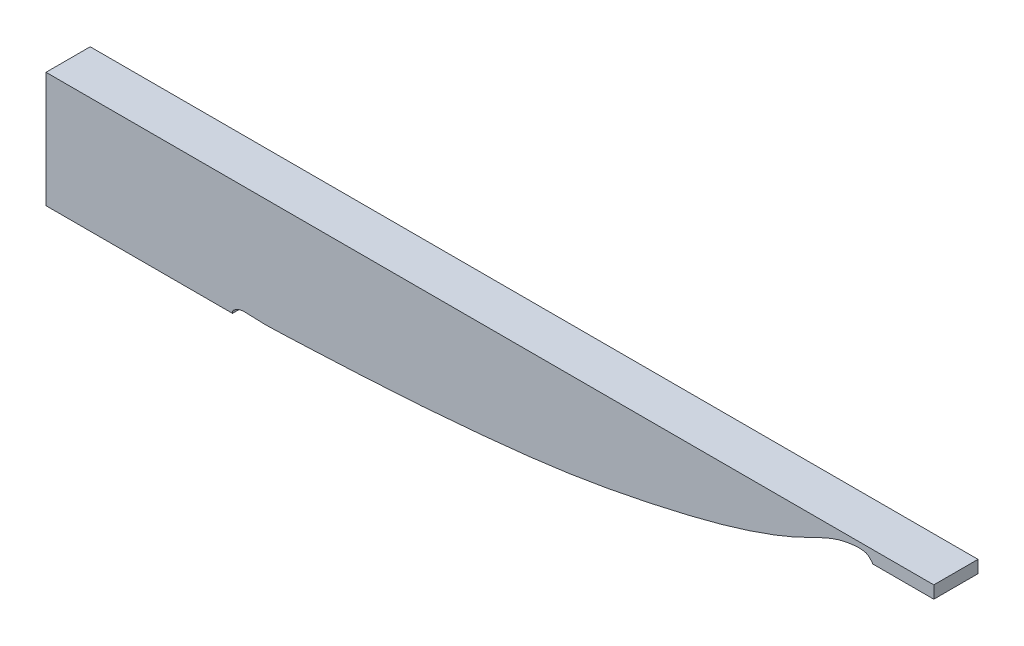
ISO-10303-21;
HEADER;
FILE_DESCRIPTION(('STEP AP214'),'2;1');
FILE_NAME('part.step','',(''),(''),'','','');
FILE_SCHEMA(('AUTOMOTIVE_DESIGN { 1 0 10303 214 1 1 1 1 }'));
ENDSEC;
DATA;
#1=APPLICATION_CONTEXT('core data for automotive mechanical design processes');
#2=APPLICATION_PROTOCOL_DEFINITION('international standard','automotive_design',2000,#1);
#3=PRODUCT_CONTEXT('',#1,'mechanical');
#4=PRODUCT('Part','Part','',(#3));
#5=PRODUCT_RELATED_PRODUCT_CATEGORY('part','',(#4));
#6=PRODUCT_DEFINITION_FORMATION('','',#4);
#7=PRODUCT_DEFINITION_CONTEXT('part definition',#1,'design');
#8=PRODUCT_DEFINITION('design','',#6,#7);
#9=PRODUCT_DEFINITION_SHAPE('','',#8);
#10=(LENGTH_UNIT() NAMED_UNIT(*) SI_UNIT(.MILLI.,.METRE.));
#11=(NAMED_UNIT(*) PLANE_ANGLE_UNIT() SI_UNIT($,.RADIAN.));
#12=(NAMED_UNIT(*) SI_UNIT($,.STERADIAN.) SOLID_ANGLE_UNIT());
#13=UNCERTAINTY_MEASURE_WITH_UNIT(LENGTH_MEASURE(1.E-05),#10,'distance_accuracy_value','');
#14=(GEOMETRIC_REPRESENTATION_CONTEXT(3) GLOBAL_UNCERTAINTY_ASSIGNED_CONTEXT((#13)) GLOBAL_UNIT_ASSIGNED_CONTEXT((#10,
#11,#12)) REPRESENTATION_CONTEXT('',''));
#15=CARTESIAN_POINT('',(0.,0.,0.));
#16=DIRECTION('',(0.,0.,1.));
#17=DIRECTION('',(1.,0.,0.));
#18=AXIS2_PLACEMENT_3D('',#15,#16,#17);
#19=CARTESIAN_POINT('',(-55.9507466785348,-18.6646330388877,412.));
#20=CARTESIAN_POINT('',(-55.9618483439373,-18.5868726479807,412.));
#21=CARTESIAN_POINT('',(-55.9713137642388,-18.5082963069033,412.));
#22=CARTESIAN_POINT('',(-55.9575781511791,-18.3524803237736,412.));
#23=CARTESIAN_POINT('',(-55.9346658038081,-18.275614214316,412.));
#24=CARTESIAN_POINT('',(-55.8561899403003,-18.1388041049245,412.));
#25=CARTESIAN_POINT('',(-55.7995714274001,-18.0829048145552,412.));
#26=CARTESIAN_POINT('',(-55.6755714015902,-17.985460123134,412.));
#27=CARTESIAN_POINT('',(-55.6110584952958,-17.9401519643801,412.));
#28=CARTESIAN_POINT('',(-55.41836964489,-17.8030727993113,412.));
#29=CARTESIAN_POINT('',(-55.2863429821878,-17.7177634453526,412.));
#30=CARTESIAN_POINT('',(-55.010940279751,-17.5681351860949,412.));
#31=CARTESIAN_POINT('',(-54.8641568253128,-17.5054734031068,412.));
#32=CARTESIAN_POINT('',(-54.4148637419052,-17.3701670825816,412.));
#33=CARTESIAN_POINT('',(-54.1086050483666,-17.3397477437669,412.));
#34=CARTESIAN_POINT('',(-53.4914263972212,-17.3203168341647,412.));
#35=CARTESIAN_POINT('',(-53.1801527164026,-17.3312899646658,412.));
#36=CARTESIAN_POINT('',(-52.5597191109608,-17.3674419140686,412.));
#37=CARTESIAN_POINT('',(-52.2498102413062,-17.3926137532899,412.));
#38=CARTESIAN_POINT('',(-51.6294422074059,-17.4302767024075,412.));
#39=CARTESIAN_POINT('',(-51.319013333807,-17.4434658156988,412.));
#40=CARTESIAN_POINT('',(-50.3871019127377,-17.4686355524182,412.));
#41=CARTESIAN_POINT('',(-49.7649156685375,-17.4653317147602,412.));
#42=CARTESIAN_POINT('',(-48.5223301611767,-17.434749026717,412.));
#43=CARTESIAN_POINT('',(-47.9013620366019,-17.410608116258,412.));
#44=CARTESIAN_POINT('',(-46.6594362231941,-17.3620418113259,412.));
#45=CARTESIAN_POINT('',(-46.0384597845401,-17.3381275471983,412.));
#46=CARTESIAN_POINT('',(-44.1756765702553,-17.2624019434286,412.));
#47=CARTESIAN_POINT('',(-42.9340161664173,-17.206600428896,412.));
#48=CARTESIAN_POINT('',(-39.2090594217144,-17.03852890669,412.));
#49=CARTESIAN_POINT('',(-36.7258846247488,-16.9235193772693,412.));
#50=CARTESIAN_POINT('',(-31.7602144743949,-16.6795030591285,412.));
#51=CARTESIAN_POINT('',(-29.2778597259503,-16.5460476368477,412.));
#52=CARTESIAN_POINT('',(-24.3157035866492,-16.2430328545481,412.));
#53=CARTESIAN_POINT('',(-21.8360716141098,-16.0723539153344,412.));
#54=CARTESIAN_POINT('',(-16.8800745276957,-15.6876858488001,412.));
#55=CARTESIAN_POINT('',(-14.40350825215,-15.4763636105923,412.));
#56=CARTESIAN_POINT('',(-9.45300915832431,-15.0188062281547,412.));
#57=CARTESIAN_POINT('',(-6.9794361892871,-14.7745927261019,412.));
#58=CARTESIAN_POINT('',(-2.03842755954126,-14.2346595729807,412.));
#59=CARTESIAN_POINT('',(0.428912393799549,-13.9375998494655,412.));
#60=CARTESIAN_POINT('',(5.35356901091051,-13.2576613660988,412.));
#61=CARTESIAN_POINT('',(7.81075197964893,-12.8730603862127,412.));
#62=CARTESIAN_POINT('',(12.7086066457988,-12.0171441268432,412.));
#63=CARTESIAN_POINT('',(15.1508433098289,-11.547731309918,412.));
#64=CARTESIAN_POINT('',(20.0205245178066,-10.5482881323024,412.));
#65=CARTESIAN_POINT('',(22.4482424108984,-10.0170321541631,412.));
#66=CARTESIAN_POINT('',(27.2867573658359,-8.87960657468269,412.));
#67=CARTESIAN_POINT('',(29.6990638193945,-8.27501239194307,412.));
#68=CARTESIAN_POINT('',(33.2936384382901,-7.28049411762777,412.));
#69=CARTESIAN_POINT('',(34.4873672316955,-6.93423162845822,412.));
#70=CARTESIAN_POINT('',(36.8629351976829,-6.20239274678684,412.));
#71=CARTESIAN_POINT('',(38.0447019851699,-5.8159864958159,412.));
#72=CARTESIAN_POINT('',(40.3954412113626,-5.00333305465624,412.));
#73=CARTESIAN_POINT('',(41.5634076618646,-4.57846203829595,412.));
#74=CARTESIAN_POINT('',(43.8789876669419,-3.67773772371269,412.));
#75=CARTESIAN_POINT('',(45.0264234953052,-3.20143923636977,412.));
#76=CARTESIAN_POINT('',(46.7245448223478,-2.42929725371938,412.));
#77=CARTESIAN_POINT('',(47.2868128895861,-2.16243561974866,412.));
#78=CARTESIAN_POINT('',(48.4071551338876,-1.61853389202165,412.));
#79=CARTESIAN_POINT('',(48.9646564778532,-1.34004178043277,412.));
#80=CARTESIAN_POINT('',(50.6403472670598,-0.512373348629905,412.));
#81=CARTESIAN_POINT('',(51.7628515395379,0.0262311742687947,412.));
#82=CARTESIAN_POINT('',(53.5251019276002,0.641819148497883,412.));
#83=CARTESIAN_POINT('',(54.1262605259296,0.813346225540941,412.));
#84=CARTESIAN_POINT('',(55.0495714543538,1.01778056252495,412.));
#85=CARTESIAN_POINT('',(55.3614569827319,1.07742249808663,412.));
#86=CARTESIAN_POINT('',(55.9851021826454,1.1764671986229,412.));
#87=CARTESIAN_POINT('',(56.2977100409018,1.21578156619861,412.));
#88=CARTESIAN_POINT('',(56.9246774174292,1.27163955811577,412.));
#89=CARTESIAN_POINT('',(57.2389974503333,1.28869647336233,412.));
#90=CARTESIAN_POINT('',(57.7131982350833,1.2789135861005,412.));
#91=CARTESIAN_POINT('',(57.8718691777407,1.26989225671702,412.));
#92=CARTESIAN_POINT('',(58.1896174905541,1.23794008323549,412.));
#93=CARTESIAN_POINT('',(58.3468668770223,1.21461933020707,412.));
#94=CARTESIAN_POINT('',(58.6555721138046,1.14178852271897,412.));
#95=CARTESIAN_POINT('',(58.8094106926655,1.09069739714757,412.));
#96=CARTESIAN_POINT('',(59.0927039131636,0.94588496798876,412.));
#97=CARTESIAN_POINT('',(59.21926661255,0.849633739607471,412.));
#98=CARTESIAN_POINT('',(59.4540983444932,0.631248822941624,412.));
#99=CARTESIAN_POINT('',(59.5593389403813,0.51081788673081,412.));
#100=CARTESIAN_POINT('',(59.722541160645,0.335101835378209,412.));
#101=CARTESIAN_POINT('',(59.777144617452,0.276716937506994,412.));
#102=CARTESIAN_POINT('',(59.8747784353196,0.14926450559872,412.));
#103=CARTESIAN_POINT('',(59.9151196905525,0.0789749356872767,412.));
#104=CARTESIAN_POINT('',(59.9324835366639,-1.33265387657414E-13,412.));
#105=B_SPLINE_CURVE_WITH_KNOTS('',3,(#19,#20,#21,#22,#23,#24,#25,#26,#27,#28,#29,#30,#31,#32,
#33,#34,#35,#36,#37,#38,#39,#40,#41,#42,#43,#44,#45,#46,#47,#48,#49,#50,#51,#52,#53,#54,#55,#56,
#57,#58,#59,#60,#61,#62,#63,#64,#65,#66,#67,#68,#69,#70,#71,#72,#73,#74,#75,#76,#77,#78,#79,#80,
#81,#82,#83,#84,#85,#86,#87,#88,#89,#90,#91,#92,#93,#94,#95,#96,#97,#98,#99,#100,#101,#102,#103,
#104),.UNSPECIFIED.,.F.,.F.,(4,2,2,2,2,2,2,2,2,2,2,2,2,2,2,2,2,2,2,2,2,2,2,2,2,2,2,2,2,2,2,2,2,
2,2,2,2,2,2,2,2,2,4),(0.,0.001953125,0.00390624999999989,0.00585937499999978,
0.00781249999999967,0.0117187499999997,0.0156249999999996,0.0234374999999994,0.0312499999999993,
0.0390624999999992,0.0468749999999991,0.062499999999999,0.0781249999999989,0.0937499999999989,
0.124999999999999,0.187499999999999,0.249999999999999,0.312499999999999,0.374999999999999,
0.437499999999999,0.5,0.5625,0.625,0.6875,0.75,0.78125,0.8125,0.84375,0.875,0.890625,0.90625,
0.9375,0.953125,0.9609375,0.96875,0.9765625,0.98046875,0.984375,0.98828125,0.9921875,0.99609375,
0.998046875,1.),.UNSPECIFIED.);
#106=DIRECTION('',(0.,0.,-1.));
#107=VECTOR('',#106,1.);
#108=SURFACE_OF_LINEAR_EXTRUSION('',#105,#107);
#109=CARTESIAN_POINT('',(-55.9507466785348,-18.6646330388877,404.));
#110=CARTESIAN_POINT('',(-55.9618483439373,-18.5868726479807,404.));
#111=CARTESIAN_POINT('',(-55.9713137642388,-18.5082963069033,404.));
#112=CARTESIAN_POINT('',(-55.9575781511791,-18.3524803237736,404.));
#113=CARTESIAN_POINT('',(-55.9346658038081,-18.275614214316,404.));
#114=CARTESIAN_POINT('',(-55.8561899403003,-18.1388041049245,404.));
#115=CARTESIAN_POINT('',(-55.7995714274001,-18.0829048145552,404.));
#116=CARTESIAN_POINT('',(-55.6755714015902,-17.985460123134,404.));
#117=CARTESIAN_POINT('',(-55.6110584952958,-17.9401519643801,404.));
#118=CARTESIAN_POINT('',(-55.41836964489,-17.8030727993113,404.));
#119=CARTESIAN_POINT('',(-55.2863429821878,-17.7177634453526,404.));
#120=CARTESIAN_POINT('',(-55.010940279751,-17.5681351860949,404.));
#121=CARTESIAN_POINT('',(-54.8641568253128,-17.5054734031068,404.));
#122=CARTESIAN_POINT('',(-54.4148637419052,-17.3701670825816,404.));
#123=CARTESIAN_POINT('',(-54.1086050483666,-17.3397477437669,404.));
#124=CARTESIAN_POINT('',(-53.4914263972212,-17.3203168341647,404.));
#125=CARTESIAN_POINT('',(-53.1801527164026,-17.3312899646658,404.));
#126=CARTESIAN_POINT('',(-52.5597191109608,-17.3674419140686,404.));
#127=CARTESIAN_POINT('',(-52.2498102413062,-17.3926137532899,404.));
#128=CARTESIAN_POINT('',(-51.6294422074059,-17.4302767024075,404.));
#129=CARTESIAN_POINT('',(-51.319013333807,-17.4434658156988,404.));
#130=CARTESIAN_POINT('',(-50.3871019127377,-17.4686355524182,404.));
#131=CARTESIAN_POINT('',(-49.7649156685375,-17.4653317147602,404.));
#132=CARTESIAN_POINT('',(-48.5223301611767,-17.434749026717,404.));
#133=CARTESIAN_POINT('',(-47.9013620366019,-17.410608116258,404.));
#134=CARTESIAN_POINT('',(-46.6594362231941,-17.3620418113259,404.));
#135=CARTESIAN_POINT('',(-46.0384597845401,-17.3381275471983,404.));
#136=CARTESIAN_POINT('',(-44.1756765702553,-17.2624019434286,404.));
#137=CARTESIAN_POINT('',(-42.9340161664173,-17.206600428896,404.));
#138=CARTESIAN_POINT('',(-39.2090594217144,-17.03852890669,404.));
#139=CARTESIAN_POINT('',(-36.7258846247488,-16.9235193772693,404.));
#140=CARTESIAN_POINT('',(-31.7602144743949,-16.6795030591285,404.));
#141=CARTESIAN_POINT('',(-29.2778597259503,-16.5460476368477,404.));
#142=CARTESIAN_POINT('',(-24.3157035866492,-16.2430328545481,404.));
#143=CARTESIAN_POINT('',(-21.8360716141098,-16.0723539153344,404.));
#144=CARTESIAN_POINT('',(-16.8800745276957,-15.6876858488001,404.));
#145=CARTESIAN_POINT('',(-14.40350825215,-15.4763636105923,404.));
#146=CARTESIAN_POINT('',(-9.45300915832431,-15.0188062281547,404.));
#147=CARTESIAN_POINT('',(-6.9794361892871,-14.7745927261019,404.));
#148=CARTESIAN_POINT('',(-2.03842755954126,-14.2346595729807,404.));
#149=CARTESIAN_POINT('',(0.428912393799549,-13.9375998494655,404.));
#150=CARTESIAN_POINT('',(5.35356901091051,-13.2576613660988,404.));
#151=CARTESIAN_POINT('',(7.81075197964893,-12.8730603862127,404.));
#152=CARTESIAN_POINT('',(12.7086066457988,-12.0171441268432,404.));
#153=CARTESIAN_POINT('',(15.1508433098289,-11.547731309918,404.));
#154=CARTESIAN_POINT('',(20.0205245178066,-10.5482881323024,404.));
#155=CARTESIAN_POINT('',(22.4482424108984,-10.0170321541631,404.));
#156=CARTESIAN_POINT('',(27.2867573658359,-8.87960657468269,404.));
#157=CARTESIAN_POINT('',(29.6990638193945,-8.27501239194307,404.));
#158=CARTESIAN_POINT('',(33.2936384382901,-7.28049411762777,404.));
#159=CARTESIAN_POINT('',(34.4873672316955,-6.93423162845822,404.));
#160=CARTESIAN_POINT('',(36.8629351976829,-6.20239274678684,404.));
#161=CARTESIAN_POINT('',(38.0447019851699,-5.8159864958159,404.));
#162=CARTESIAN_POINT('',(40.3954412113626,-5.00333305465624,404.));
#163=CARTESIAN_POINT('',(41.5634076618646,-4.57846203829595,404.));
#164=CARTESIAN_POINT('',(43.8789876669419,-3.67773772371269,404.));
#165=CARTESIAN_POINT('',(45.0264234953052,-3.20143923636977,404.));
#166=CARTESIAN_POINT('',(46.7245448223478,-2.42929725371938,404.));
#167=CARTESIAN_POINT('',(47.2868128895861,-2.16243561974866,404.));
#168=CARTESIAN_POINT('',(48.4071551338876,-1.61853389202165,404.));
#169=CARTESIAN_POINT('',(48.9646564778532,-1.34004178043277,404.));
#170=CARTESIAN_POINT('',(50.6403472670598,-0.512373348629905,404.));
#171=CARTESIAN_POINT('',(51.7628515395379,0.0262311742687947,404.));
#172=CARTESIAN_POINT('',(53.5251019276002,0.641819148497883,404.));
#173=CARTESIAN_POINT('',(54.1262605259296,0.813346225540941,404.));
#174=CARTESIAN_POINT('',(55.0495714543538,1.01778056252495,404.));
#175=CARTESIAN_POINT('',(55.3614569827319,1.07742249808663,404.));
#176=CARTESIAN_POINT('',(55.9851021826454,1.1764671986229,404.));
#177=CARTESIAN_POINT('',(56.2977100409018,1.21578156619861,404.));
#178=CARTESIAN_POINT('',(56.9246774174292,1.27163955811577,404.));
#179=CARTESIAN_POINT('',(57.2389974503333,1.28869647336233,404.));
#180=CARTESIAN_POINT('',(57.7131982350833,1.2789135861005,404.));
#181=CARTESIAN_POINT('',(57.8718691777407,1.26989225671702,404.));
#182=CARTESIAN_POINT('',(58.1896174905541,1.23794008323549,404.));
#183=CARTESIAN_POINT('',(58.3468668770223,1.21461933020707,404.));
#184=CARTESIAN_POINT('',(58.6555721138046,1.14178852271897,404.));
#185=CARTESIAN_POINT('',(58.8094106926655,1.09069739714757,404.));
#186=CARTESIAN_POINT('',(59.0927039131636,0.94588496798876,404.));
#187=CARTESIAN_POINT('',(59.21926661255,0.849633739607471,404.));
#188=CARTESIAN_POINT('',(59.4540983444932,0.631248822941624,404.));
#189=CARTESIAN_POINT('',(59.5593389403813,0.51081788673081,404.));
#190=CARTESIAN_POINT('',(59.722541160645,0.335101835378209,404.));
#191=CARTESIAN_POINT('',(59.777144617452,0.276716937506994,404.));
#192=CARTESIAN_POINT('',(59.8747784353196,0.14926450559872,404.));
#193=CARTESIAN_POINT('',(59.9151196905525,0.0789749356872767,404.));
#194=CARTESIAN_POINT('',(59.9324835366639,-1.33265387657414E-13,404.));
#195=B_SPLINE_CURVE_WITH_KNOTS('',3,(#109,#110,#111,#112,#113,#114,#115,#116,#117,#118,#119,
#120,#121,#122,#123,#124,#125,#126,#127,#128,#129,#130,#131,#132,#133,#134,#135,#136,#137,#138,
#139,#140,#141,#142,#143,#144,#145,#146,#147,#148,#149,#150,#151,#152,#153,#154,#155,#156,#157,
#158,#159,#160,#161,#162,#163,#164,#165,#166,#167,#168,#169,#170,#171,#172,#173,#174,#175,#176,
#177,#178,#179,#180,#181,#182,#183,#184,#185,#186,#187,#188,#189,#190,#191,#192,#193,#194),
.UNSPECIFIED.,.F.,.F.,(4,2,2,2,2,2,2,2,2,2,2,2,2,2,2,2,2,2,2,2,2,2,2,2,2,2,2,2,2,2,2,2,2,2,2,2,
2,2,2,2,2,2,4),(0.,0.001953125,0.00390624999999989,0.00585937499999978,0.00781249999999967,
0.0117187499999997,0.0156249999999996,0.0234374999999994,0.0312499999999993,0.0390624999999992,
0.0468749999999991,0.062499999999999,0.0781249999999989,0.0937499999999989,0.124999999999999,
0.187499999999999,0.249999999999999,0.312499999999999,0.374999999999999,0.437499999999999,0.5,
0.5625,0.625,0.6875,0.75,0.78125,0.8125,0.84375,0.875,0.890625,0.90625,0.9375,0.953125,
0.9609375,0.96875,0.9765625,0.98046875,0.984375,0.98828125,0.9921875,0.99609375,0.998046875,1.),.UNSPECIFIED.);
#196=CARTESIAN_POINT('',(-55.9507466785348,-18.6646330388877,404.));
#197=VERTEX_POINT('',#196);
#198=CARTESIAN_POINT('',(59.9324835366639,0.,404.));
#199=VERTEX_POINT('',#198);
#200=EDGE_CURVE('E165',#197,#199,#195,.T.);
#201=ORIENTED_EDGE('',*,*,#200,.T.);
#202=DIRECTION('',(0.,0.,-1.));
#203=VECTOR('',#202,1.);
#204=CARTESIAN_POINT('',(59.9324835366639,0.,412.));
#205=LINE('',#204,#203);
#206=CARTESIAN_POINT('',(59.9324835366639,0.,412.));
#207=VERTEX_POINT('',#206);
#208=EDGE_CURVE('E11',#207,#199,#205,.T.);
#209=ORIENTED_EDGE('',*,*,#208,.F.);
#210=CARTESIAN_POINT('',(59.9324835366639,-1.33265387657414E-13,412.));
#211=CARTESIAN_POINT('',(59.9151196905525,0.0789749356872767,412.));
#212=CARTESIAN_POINT('',(59.8747784353196,0.14926450559872,412.));
#213=CARTESIAN_POINT('',(59.777144617452,0.276716937506994,412.));
#214=CARTESIAN_POINT('',(59.722541160645,0.335101835378209,412.));
#215=CARTESIAN_POINT('',(59.5593389403813,0.51081788673081,412.));
#216=CARTESIAN_POINT('',(59.4540983444932,0.631248822941624,412.));
#217=CARTESIAN_POINT('',(59.21926661255,0.849633739607471,412.));
#218=CARTESIAN_POINT('',(59.0927039131636,0.94588496798876,412.));
#219=CARTESIAN_POINT('',(58.8094106926655,1.09069739714757,412.));
#220=CARTESIAN_POINT('',(58.6555721138046,1.14178852271897,412.));
#221=CARTESIAN_POINT('',(58.3468668770223,1.21461933020707,412.));
#222=CARTESIAN_POINT('',(58.1896174905541,1.23794008323549,412.));
#223=CARTESIAN_POINT('',(57.8718691777407,1.26989225671702,412.));
#224=CARTESIAN_POINT('',(57.7131982350833,1.2789135861005,412.));
#225=CARTESIAN_POINT('',(57.2389974503333,1.28869647336233,412.));
#226=CARTESIAN_POINT('',(56.9246774174292,1.27163955811577,412.));
#227=CARTESIAN_POINT('',(56.2977100409018,1.21578156619861,412.));
#228=CARTESIAN_POINT('',(55.9851021826454,1.1764671986229,412.));
#229=CARTESIAN_POINT('',(55.3614569827319,1.07742249808663,412.));
#230=CARTESIAN_POINT('',(55.0495714543538,1.01778056252495,412.));
#231=CARTESIAN_POINT('',(54.1262605259296,0.813346225540941,412.));
#232=CARTESIAN_POINT('',(53.5251019276002,0.641819148497883,412.));
#233=CARTESIAN_POINT('',(51.7628515395379,0.0262311742687947,412.));
#234=CARTESIAN_POINT('',(50.6403472670598,-0.512373348629905,412.));
#235=CARTESIAN_POINT('',(48.9646564778532,-1.34004178043277,412.));
#236=CARTESIAN_POINT('',(48.4071551338876,-1.61853389202165,412.));
#237=CARTESIAN_POINT('',(47.2868128895861,-2.16243561974866,412.));
#238=CARTESIAN_POINT('',(46.7245448223478,-2.42929725371938,412.));
#239=CARTESIAN_POINT('',(45.0264234953052,-3.20143923636977,412.));
#240=CARTESIAN_POINT('',(43.8789876669419,-3.67773772371269,412.));
#241=CARTESIAN_POINT('',(41.5634076618646,-4.57846203829595,412.));
#242=CARTESIAN_POINT('',(40.3954412113626,-5.00333305465624,412.));
#243=CARTESIAN_POINT('',(38.0447019851699,-5.8159864958159,412.));
#244=CARTESIAN_POINT('',(36.8629351976829,-6.20239274678684,412.));
#245=CARTESIAN_POINT('',(34.4873672316955,-6.93423162845822,412.));
#246=CARTESIAN_POINT('',(33.2936384382901,-7.28049411762777,412.));
#247=CARTESIAN_POINT('',(29.6990638193945,-8.27501239194307,412.));
#248=CARTESIAN_POINT('',(27.2867573658359,-8.87960657468269,412.));
#249=CARTESIAN_POINT('',(22.4482424108984,-10.0170321541631,412.));
#250=CARTESIAN_POINT('',(20.0205245178066,-10.5482881323024,412.));
#251=CARTESIAN_POINT('',(15.1508433098289,-11.547731309918,412.));
#252=CARTESIAN_POINT('',(12.7086066457988,-12.0171441268432,412.));
#253=CARTESIAN_POINT('',(7.81075197964893,-12.8730603862127,412.));
#254=CARTESIAN_POINT('',(5.35356901091051,-13.2576613660988,412.));
#255=CARTESIAN_POINT('',(0.428912393799549,-13.9375998494655,412.));
#256=CARTESIAN_POINT('',(-2.03842755954126,-14.2346595729807,412.));
#257=CARTESIAN_POINT('',(-6.9794361892871,-14.7745927261019,412.));
#258=CARTESIAN_POINT('',(-9.45300915832431,-15.0188062281547,412.));
#259=CARTESIAN_POINT('',(-14.40350825215,-15.4763636105923,412.));
#260=CARTESIAN_POINT('',(-16.8800745276957,-15.6876858488001,412.));
#261=CARTESIAN_POINT('',(-21.8360716141098,-16.0723539153344,412.));
#262=CARTESIAN_POINT('',(-24.3157035866492,-16.2430328545481,412.));
#263=CARTESIAN_POINT('',(-29.2778597259503,-16.5460476368477,412.));
#264=CARTESIAN_POINT('',(-31.7602144743949,-16.6795030591285,412.));
#265=CARTESIAN_POINT('',(-36.7258846247488,-16.9235193772693,412.));
#266=CARTESIAN_POINT('',(-39.2090594217144,-17.03852890669,412.));
#267=CARTESIAN_POINT('',(-42.9340161664173,-17.206600428896,412.));
#268=CARTESIAN_POINT('',(-44.1756765702553,-17.2624019434286,412.));
#269=CARTESIAN_POINT('',(-46.0384597845401,-17.3381275471983,412.));
#270=CARTESIAN_POINT('',(-46.6594362231941,-17.3620418113259,412.));
#271=CARTESIAN_POINT('',(-47.9013620366019,-17.410608116258,412.));
#272=CARTESIAN_POINT('',(-48.5223301611767,-17.434749026717,412.));
#273=CARTESIAN_POINT('',(-49.7649156685375,-17.4653317147602,412.));
#274=CARTESIAN_POINT('',(-50.3871019127377,-17.4686355524182,412.));
#275=CARTESIAN_POINT('',(-51.319013333807,-17.4434658156988,412.));
#276=CARTESIAN_POINT('',(-51.6294422074059,-17.4302767024075,412.));
#277=CARTESIAN_POINT('',(-52.2498102413062,-17.3926137532899,412.));
#278=CARTESIAN_POINT('',(-52.5597191109608,-17.3674419140686,412.));
#279=CARTESIAN_POINT('',(-53.1801527164026,-17.3312899646658,412.));
#280=CARTESIAN_POINT('',(-53.4914263972212,-17.3203168341647,412.));
#281=CARTESIAN_POINT('',(-54.1086050483666,-17.3397477437669,412.));
#282=CARTESIAN_POINT('',(-54.4148637419052,-17.3701670825816,412.));
#283=CARTESIAN_POINT('',(-54.8641568253128,-17.5054734031068,412.));
#284=CARTESIAN_POINT('',(-55.010940279751,-17.5681351860949,412.));
#285=CARTESIAN_POINT('',(-55.2863429821878,-17.7177634453526,412.));
#286=CARTESIAN_POINT('',(-55.41836964489,-17.8030727993113,412.));
#287=CARTESIAN_POINT('',(-55.6110584952958,-17.9401519643801,412.));
#288=CARTESIAN_POINT('',(-55.6755714015902,-17.985460123134,412.));
#289=CARTESIAN_POINT('',(-55.7995714274001,-18.0829048145552,412.));
#290=CARTESIAN_POINT('',(-55.8561899403003,-18.1388041049245,412.));
#291=CARTESIAN_POINT('',(-55.9346658038081,-18.275614214316,412.));
#292=CARTESIAN_POINT('',(-55.9575781511791,-18.3524803237736,412.));
#293=CARTESIAN_POINT('',(-55.9713137642388,-18.5082963069033,412.));
#294=CARTESIAN_POINT('',(-55.9618483439373,-18.5868726479807,412.));
#295=CARTESIAN_POINT('',(-55.9507466785348,-18.6646330388877,412.));
#296=B_SPLINE_CURVE_WITH_KNOTS('',3,(#210,#211,#212,#213,#214,#215,#216,#217,#218,#219,#220,
#221,#222,#223,#224,#225,#226,#227,#228,#229,#230,#231,#232,#233,#234,#235,#236,#237,#238,#239,
#240,#241,#242,#243,#244,#245,#246,#247,#248,#249,#250,#251,#252,#253,#254,#255,#256,#257,#258,
#259,#260,#261,#262,#263,#264,#265,#266,#267,#268,#269,#270,#271,#272,#273,#274,#275,#276,#277,
#278,#279,#280,#281,#282,#283,#284,#285,#286,#287,#288,#289,#290,#291,#292,#293,#294,#295),
.UNSPECIFIED.,.F.,.F.,(4,2,2,2,2,2,2,2,2,2,2,2,2,2,2,2,2,2,2,2,2,2,2,2,2,2,2,2,2,2,2,2,2,2,2,2,
2,2,2,2,2,2,4),(0.,0.001953125,0.00390625,0.0078125,0.01171875,0.015625,0.0195312499999999,
0.0234374999999999,0.0312499999999999,0.0390624999999999,0.0468749999999998,0.0624999999999998,
0.0937499999999997,0.109375,0.125,0.15625,0.1875,0.21875,0.25,0.3125,0.375,0.4375,0.5,
0.562500000000001,0.625000000000001,0.687500000000001,0.750000000000001,0.812500000000001,
0.875000000000001,0.906250000000001,0.921875000000001,0.937500000000001,0.953125000000001,
0.960937500000001,0.968750000000001,0.976562500000001,0.984375,0.98828125,0.9921875,0.994140625,
0.99609375,0.998046875,1.),.UNSPECIFIED.);
#297=CARTESIAN_POINT('',(-55.9507466785348,-18.6646330388877,412.));
#298=VERTEX_POINT('',#297);
#299=EDGE_CURVE('E129',#298,#207,#296,.F.);
#300=ORIENTED_EDGE('',*,*,#299,.F.);
#301=DIRECTION('',(0.,0.,-1.));
#302=VECTOR('',#301,1.);
#303=CARTESIAN_POINT('',(-55.9507466785348,-18.6646330388877,412.));
#304=LINE('',#303,#302);
#305=EDGE_CURVE('E114',#298,#197,#304,.T.);
#306=ORIENTED_EDGE('',*,*,#305,.T.);
#307=EDGE_LOOP('',(#201,#209,#300,#306));
#308=FACE_BOUND('',#307,.T.);
#309=ADVANCED_FACE('F30',(#308),#108,.F.);
#310=CARTESIAN_POINT('',(59.9324835366639,0.,412.));
#311=DIRECTION('',(0.,1.,0.));
#312=DIRECTION('',(-1.,0.,0.));
#313=AXIS2_PLACEMENT_3D('',#310,#311,#312);
#314=PLANE('',#313);
#315=DIRECTION('',(1.,0.,0.));
#316=VECTOR('',#315,1.);
#317=CARTESIAN_POINT('',(59.9324835366639,0.,404.));
#318=LINE('',#317,#316);
#319=CARTESIAN_POINT('',(70.9967569121498,0.,404.));
#320=VERTEX_POINT('',#319);
#321=EDGE_CURVE('E120',#199,#320,#318,.T.);
#322=ORIENTED_EDGE('',*,*,#321,.T.);
#323=DIRECTION('',(0.,0.,-1.));
#324=VECTOR('',#323,1.);
#325=CARTESIAN_POINT('',(70.9967569121498,0.,412.));
#326=LINE('',#325,#324);
#327=CARTESIAN_POINT('',(70.9967569121498,0.,412.));
#328=VERTEX_POINT('',#327);
#329=EDGE_CURVE('E41',#328,#320,#326,.T.);
#330=ORIENTED_EDGE('',*,*,#329,.F.);
#331=DIRECTION('',(1.,0.,0.));
#332=VECTOR('',#331,1.);
#333=CARTESIAN_POINT('',(59.9324835366639,0.,412.));
#334=LINE('',#333,#332);
#335=EDGE_CURVE('E87',#207,#328,#334,.T.);
#336=ORIENTED_EDGE('',*,*,#335,.F.);
#337=ORIENTED_EDGE('',*,*,#208,.T.);
#338=EDGE_LOOP('',(#322,#330,#336,#337));
#339=FACE_BOUND('',#338,.T.);
#340=ADVANCED_FACE('F199',(#339),#314,.F.);
#341=CARTESIAN_POINT('',(70.9967569121498,2.25600000000005,412.));
#342=DIRECTION('',(-1.,0.,0.));
#343=DIRECTION('',(0.,0.,1.));
#344=AXIS2_PLACEMENT_3D('',#341,#342,#343);
#345=PLANE('',#344);
#346=DIRECTION('',(0.,1.,0.));
#347=VECTOR('',#346,1.);
#348=CARTESIAN_POINT('',(70.9967569121498,2.25600000000005,404.));
#349=LINE('',#348,#347);
#350=CARTESIAN_POINT('',(70.9967569121498,2.25600000000005,404.));
#351=VERTEX_POINT('',#350);
#352=EDGE_CURVE('E118',#320,#351,#349,.T.);
#353=ORIENTED_EDGE('',*,*,#352,.T.);
#354=DIRECTION('',(0.,0.,-1.));
#355=VECTOR('',#354,1.);
#356=CARTESIAN_POINT('',(70.9967569121498,2.25600000000005,412.));
#357=LINE('',#356,#355);
#358=CARTESIAN_POINT('',(70.9967569121498,2.25600000000005,412.));
#359=VERTEX_POINT('',#358);
#360=EDGE_CURVE('E109',#359,#351,#357,.T.);
#361=ORIENTED_EDGE('',*,*,#360,.F.);
#362=DIRECTION('',(0.,1.,0.));
#363=VECTOR('',#362,1.);
#364=CARTESIAN_POINT('',(70.9967569121498,2.25600000000005,412.));
#365=LINE('',#364,#363);
#366=EDGE_CURVE('E100',#328,#359,#365,.T.);
#367=ORIENTED_EDGE('',*,*,#366,.F.);
#368=ORIENTED_EDGE('',*,*,#329,.T.);
#369=EDGE_LOOP('',(#353,#361,#367,#368));
#370=FACE_BOUND('',#369,.T.);
#371=ADVANCED_FACE('F202',(#370),#345,.F.);
#372=CARTESIAN_POINT('',(70.9967569121498,2.25600000000005,412.));
#373=DIRECTION('',(0.,-1.,0.));
#374=DIRECTION('',(1.,0.,0.));
#375=AXIS2_PLACEMENT_3D('',#372,#373,#374);
#376=PLANE('',#375);
#377=DIRECTION('',(-1.,0.,0.));
#378=VECTOR('',#377,1.);
#379=CARTESIAN_POINT('',(70.9967569121498,2.25600000000005,404.));
#380=LINE('',#379,#378);
#381=CARTESIAN_POINT('',(-89.7123813067767,2.25600000000003,404.));
#382=VERTEX_POINT('',#381);
#383=EDGE_CURVE('E108',#351,#382,#380,.T.);
#384=ORIENTED_EDGE('',*,*,#383,.T.);
#385=DIRECTION('',(0.,0.,-1.));
#386=VECTOR('',#385,1.);
#387=CARTESIAN_POINT('',(-89.7123813067767,2.25600000000003,412.));
#388=LINE('',#387,#386);
#389=CARTESIAN_POINT('',(-89.7123813067767,2.25600000000003,412.));
#390=VERTEX_POINT('',#389);
#391=EDGE_CURVE('E105',#390,#382,#388,.T.);
#392=ORIENTED_EDGE('',*,*,#391,.F.);
#393=DIRECTION('',(-1.,0.,0.));
#394=VECTOR('',#393,1.);
#395=CARTESIAN_POINT('',(70.9967569121498,2.25600000000005,412.));
#396=LINE('',#395,#394);
#397=EDGE_CURVE('E94',#359,#390,#396,.T.);
#398=ORIENTED_EDGE('',*,*,#397,.F.);
#399=ORIENTED_EDGE('',*,*,#360,.T.);
#400=EDGE_LOOP('',(#384,#392,#398,#399));
#401=FACE_BOUND('',#400,.T.);
#402=ADVANCED_FACE('F106',(#401),#376,.F.);
#403=CARTESIAN_POINT('',(-89.7123813067767,-18.6647937526208,412.));
#404=DIRECTION('',(1.,0.,0.));
#405=DIRECTION('',(0.,1.,0.));
#406=AXIS2_PLACEMENT_3D('',#403,#404,#405);
#407=PLANE('',#406);
#408=DIRECTION('',(0.,-1.,0.));
#409=VECTOR('',#408,1.);
#410=CARTESIAN_POINT('',(-89.7123813067767,-18.6647937526208,404.));
#411=LINE('',#410,#409);
#412=CARTESIAN_POINT('',(-89.7123813067767,-18.6647937526208,404.));
#413=VERTEX_POINT('',#412);
#414=EDGE_CURVE('E73',#382,#413,#411,.T.);
#415=ORIENTED_EDGE('',*,*,#414,.T.);
#416=DIRECTION('',(0.,0.,-1.));
#417=VECTOR('',#416,1.);
#418=CARTESIAN_POINT('',(-89.7123813067767,-18.6647937526208,412.));
#419=LINE('',#418,#417);
#420=CARTESIAN_POINT('',(-89.7123813067767,-18.6647937526208,412.));
#421=VERTEX_POINT('',#420);
#422=EDGE_CURVE('E110',#421,#413,#419,.T.);
#423=ORIENTED_EDGE('',*,*,#422,.F.);
#424=DIRECTION('',(0.,-1.,0.));
#425=VECTOR('',#424,1.);
#426=CARTESIAN_POINT('',(-89.7123813067767,-18.6647937526208,412.));
#427=LINE('',#426,#425);
#428=EDGE_CURVE('E98',#390,#421,#427,.T.);
#429=ORIENTED_EDGE('',*,*,#428,.F.);
#430=ORIENTED_EDGE('',*,*,#391,.T.);
#431=EDGE_LOOP('',(#415,#423,#429,#430));
#432=FACE_BOUND('',#431,.T.);
#433=ADVANCED_FACE('F112',(#432),#407,.F.);
#434=CARTESIAN_POINT('',(-89.7123813067767,-18.6647937526208,412.));
#435=DIRECTION('',(-4.7602473900205E-06,0.99999999998867,0.));
#436=DIRECTION('',(-0.99999999998867,-4.7602473900205E-06,0.));
#437=AXIS2_PLACEMENT_3D('',#434,#435,#436);
#438=PLANE('',#437);
#439=DIRECTION('',(0.99999999998867,4.7602473900205E-06,0.));
#440=VECTOR('',#439,1.);
#441=CARTESIAN_POINT('',(-89.7123813067767,-18.6647937526208,404.));
#442=LINE('',#441,#440);
#443=EDGE_CURVE('E79',#413,#197,#442,.T.);
#444=ORIENTED_EDGE('',*,*,#443,.T.);
#445=ORIENTED_EDGE('',*,*,#305,.F.);
#446=DIRECTION('',(0.99999999998867,4.7602473900205E-06,0.));
#447=VECTOR('',#446,1.);
#448=CARTESIAN_POINT('',(-89.7123813067767,-18.6647937526208,412.));
#449=LINE('',#448,#447);
#450=EDGE_CURVE('E50',#421,#298,#449,.T.);
#451=ORIENTED_EDGE('',*,*,#450,.F.);
#452=ORIENTED_EDGE('',*,*,#422,.T.);
#453=EDGE_LOOP('',(#444,#445,#451,#452));
#454=FACE_BOUND('',#453,.T.);
#455=ADVANCED_FACE('F145',(#454),#438,.F.);
#456=CARTESIAN_POINT('',(2.89124070235508,-13.5976306077821,412.));
#457=DIRECTION('',(0.,0.,-1.));
#458=DIRECTION('',(-1.,0.,0.));
#459=AXIS2_PLACEMENT_3D('',#456,#457,#458);
#460=PLANE('',#459);
#461=ORIENTED_EDGE('',*,*,#299,.T.);
#462=ORIENTED_EDGE('',*,*,#335,.T.);
#463=ORIENTED_EDGE('',*,*,#366,.T.);
#464=ORIENTED_EDGE('',*,*,#397,.T.);
#465=ORIENTED_EDGE('',*,*,#428,.T.);
#466=ORIENTED_EDGE('',*,*,#450,.T.);
#467=EDGE_LOOP('',(#461,#462,#463,#464,#465,#466));
#468=FACE_BOUND('',#467,.T.);
#469=ADVANCED_FACE('F96',(#468),#460,.F.);
#470=CARTESIAN_POINT('',(2.89124070235508,-13.5976306077821,404.));
#471=DIRECTION('',(0.,0.,-1.));
#472=DIRECTION('',(-1.,0.,0.));
#473=AXIS2_PLACEMENT_3D('',#470,#471,#472);
#474=PLANE('',#473);
#475=ORIENTED_EDGE('',*,*,#200,.F.);
#476=ORIENTED_EDGE('',*,*,#443,.F.);
#477=ORIENTED_EDGE('',*,*,#414,.F.);
#478=ORIENTED_EDGE('',*,*,#383,.F.);
#479=ORIENTED_EDGE('',*,*,#352,.F.);
#480=ORIENTED_EDGE('',*,*,#321,.F.);
#481=EDGE_LOOP('',(#475,#476,#477,#478,#479,#480));
#482=FACE_BOUND('',#481,.T.);
#483=ADVANCED_FACE('F144',(#482),#474,.T.);
#484=CLOSED_SHELL('',(#309,#340,#371,#402,#433,#455,#469,#483));
#485=MANIFOLD_SOLID_BREP('B2',#484);
#486=ADVANCED_BREP_SHAPE_REPRESENTATION('',(#18,#485),#14);
#487=SHAPE_DEFINITION_REPRESENTATION(#9,#486);
ENDSEC;
END-ISO-10303-21;
